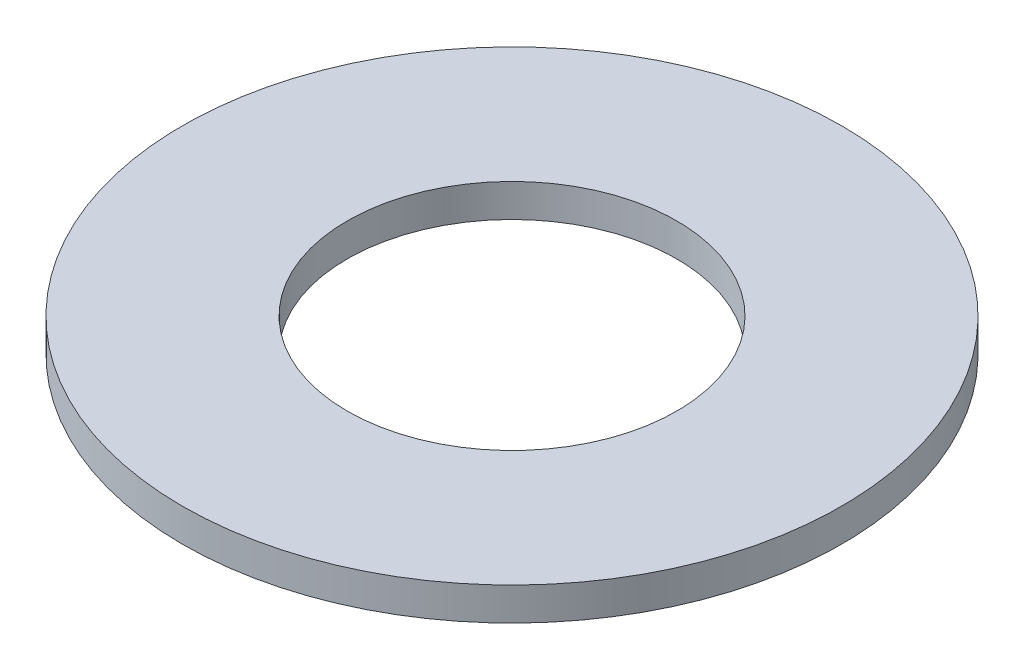
ISO-10303-21;
HEADER;
FILE_DESCRIPTION(('STEP AP214'),'2;1');
FILE_NAME('part.step','',(''),(''),'','','');
FILE_SCHEMA(('AUTOMOTIVE_DESIGN { 1 0 10303 214 1 1 1 1 }'));
ENDSEC;
DATA;
#1=APPLICATION_CONTEXT('core data for automotive mechanical design processes');
#2=APPLICATION_PROTOCOL_DEFINITION('international standard','automotive_design',2000,#1);
#3=PRODUCT_CONTEXT('',#1,'mechanical');
#4=PRODUCT('Part','Part','',(#3));
#5=PRODUCT_RELATED_PRODUCT_CATEGORY('part','',(#4));
#6=PRODUCT_DEFINITION_FORMATION('','',#4);
#7=PRODUCT_DEFINITION_CONTEXT('part definition',#1,'design');
#8=PRODUCT_DEFINITION('design','',#6,#7);
#9=PRODUCT_DEFINITION_SHAPE('','',#8);
#10=(LENGTH_UNIT() NAMED_UNIT(*) SI_UNIT(.MILLI.,.METRE.));
#11=(NAMED_UNIT(*) PLANE_ANGLE_UNIT() SI_UNIT($,.RADIAN.));
#12=(NAMED_UNIT(*) SI_UNIT($,.STERADIAN.) SOLID_ANGLE_UNIT());
#13=UNCERTAINTY_MEASURE_WITH_UNIT(LENGTH_MEASURE(1.E-05),#10,'distance_accuracy_value','');
#14=(GEOMETRIC_REPRESENTATION_CONTEXT(3) GLOBAL_UNCERTAINTY_ASSIGNED_CONTEXT((#13)) GLOBAL_UNIT_ASSIGNED_CONTEXT((#10,
#11,#12)) REPRESENTATION_CONTEXT('',''));
#15=CARTESIAN_POINT('',(0.,0.,0.));
#16=DIRECTION('',(0.,0.,1.));
#17=DIRECTION('',(1.,0.,0.));
#18=AXIS2_PLACEMENT_3D('',#15,#16,#17);
#19=CARTESIAN_POINT('',(0.,1.,0.));
#20=DIRECTION('',(0.,1.,0.));
#21=DIRECTION('',(0.,0.,1.));
#22=AXIS2_PLACEMENT_3D('',#19,#20,#21);
#23=PLANE('',#22);
#24=CARTESIAN_POINT('',(0.,1.,0.));
#25=DIRECTION('',(0.,1.,0.));
#26=DIRECTION('',(0.,0.,1.));
#27=AXIS2_PLACEMENT_3D('',#24,#25,#26);
#28=CIRCLE('',#27,10.);
#29=CARTESIAN_POINT('',(0.,1.,10.));
#30=VERTEX_POINT('',#29);
#31=EDGE_CURVE('E10',#30,#30,#28,.T.);
#32=ORIENTED_EDGE('',*,*,#31,.T.);
#33=EDGE_LOOP('',(#32));
#34=FACE_BOUND('',#33,.T.);
#35=CARTESIAN_POINT('',(0.,1.,0.));
#36=DIRECTION('',(0.,1.,0.));
#37=DIRECTION('',(0.,0.,1.));
#38=AXIS2_PLACEMENT_3D('',#35,#36,#37);
#39=CIRCLE('',#38,5.);
#40=CARTESIAN_POINT('',(0.,1.,5.));
#41=VERTEX_POINT('',#40);
#42=EDGE_CURVE('E41',#41,#41,#39,.T.);
#43=ORIENTED_EDGE('',*,*,#42,.F.);
#44=EDGE_LOOP('',(#43));
#45=FACE_BOUND('',#44,.T.);
#46=ADVANCED_FACE('F30',(#34,#45),#23,.T.);
#47=CARTESIAN_POINT('',(0.,0.,0.));
#48=DIRECTION('',(0.,1.,0.));
#49=DIRECTION('',(0.,0.,1.));
#50=AXIS2_PLACEMENT_3D('',#47,#48,#49);
#51=PLANE('',#50);
#52=CARTESIAN_POINT('',(0.,0.,0.));
#53=DIRECTION('',(0.,1.,0.));
#54=DIRECTION('',(0.,0.,1.));
#55=AXIS2_PLACEMENT_3D('',#52,#53,#54);
#56=CIRCLE('',#55,10.);
#57=CARTESIAN_POINT('',(0.,0.,10.));
#58=VERTEX_POINT('',#57);
#59=EDGE_CURVE('E34',#58,#58,#56,.T.);
#60=ORIENTED_EDGE('',*,*,#59,.F.);
#61=EDGE_LOOP('',(#60));
#62=FACE_BOUND('',#61,.T.);
#63=CARTESIAN_POINT('',(0.,0.,0.));
#64=DIRECTION('',(0.,1.,0.));
#65=DIRECTION('',(0.,0.,1.));
#66=AXIS2_PLACEMENT_3D('',#63,#64,#65);
#67=CIRCLE('',#66,5.);
#68=CARTESIAN_POINT('',(0.,0.,5.));
#69=VERTEX_POINT('',#68);
#70=EDGE_CURVE('E43',#69,#69,#67,.T.);
#71=ORIENTED_EDGE('',*,*,#70,.T.);
#72=EDGE_LOOP('',(#71));
#73=FACE_BOUND('',#72,.T.);
#74=ADVANCED_FACE('F53',(#62,#73),#51,.F.);
#75=CARTESIAN_POINT('',(0.,1.,0.));
#76=DIRECTION('',(0.,-1.,0.));
#77=DIRECTION('',(0.,0.,-1.));
#78=AXIS2_PLACEMENT_3D('',#75,#76,#77);
#79=CYLINDRICAL_SURFACE('',#78,10.);
#80=ORIENTED_EDGE('',*,*,#31,.F.);
#81=EDGE_LOOP('',(#80));
#82=FACE_BOUND('',#81,.T.);
#83=ORIENTED_EDGE('',*,*,#59,.T.);
#84=EDGE_LOOP('',(#83));
#85=FACE_BOUND('',#84,.T.);
#86=ADVANCED_FACE('F32',(#82,#85),#79,.T.);
#87=CARTESIAN_POINT('',(0.,1.,0.));
#88=DIRECTION('',(0.,-1.,0.));
#89=DIRECTION('',(0.,0.,-1.));
#90=AXIS2_PLACEMENT_3D('',#87,#88,#89);
#91=CYLINDRICAL_SURFACE('',#90,5.);
#92=ORIENTED_EDGE('',*,*,#42,.T.);
#93=EDGE_LOOP('',(#92));
#94=FACE_BOUND('',#93,.T.);
#95=ORIENTED_EDGE('',*,*,#70,.F.);
#96=EDGE_LOOP('',(#95));
#97=FACE_BOUND('',#96,.T.);
#98=ADVANCED_FACE('F49',(#94,#97),#91,.F.);
#99=CLOSED_SHELL('',(#46,#74,#86,#98));
#100=MANIFOLD_SOLID_BREP('B2',#99);
#101=ADVANCED_BREP_SHAPE_REPRESENTATION('',(#18,#100),#14);
#102=SHAPE_DEFINITION_REPRESENTATION(#9,#101);
ENDSEC;
END-ISO-10303-21;
